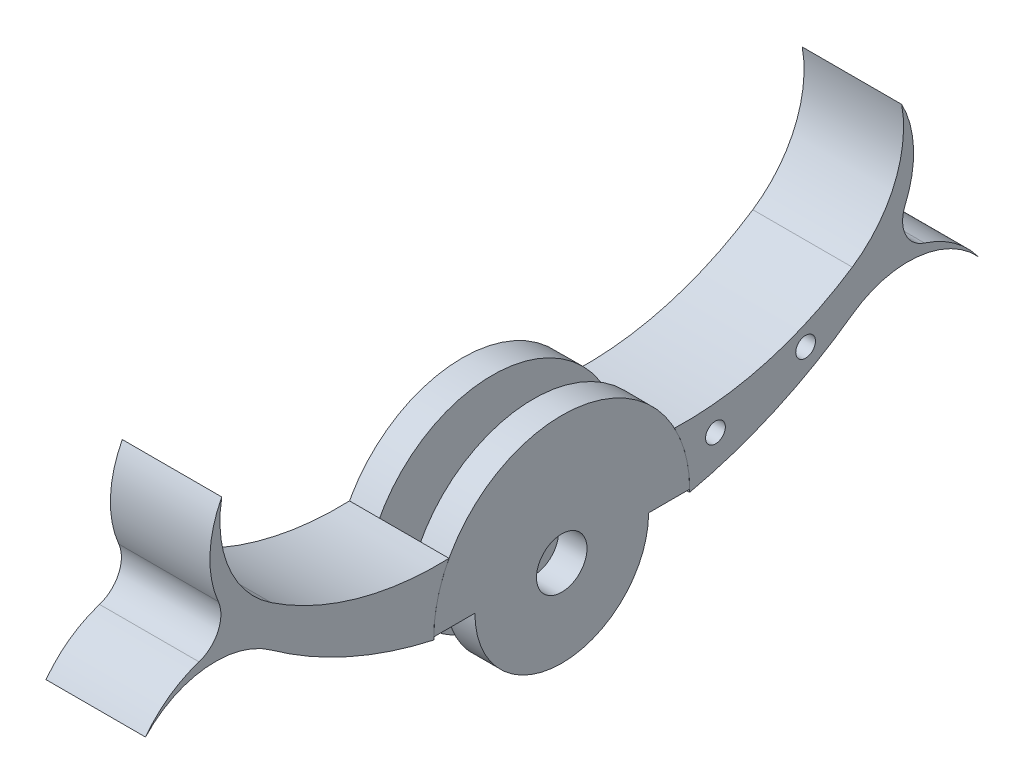
ISO-10303-21;
HEADER;
FILE_DESCRIPTION(('STEP AP214'),'2;1');
FILE_NAME('part.step','',(''),(''),'','','');
FILE_SCHEMA(('AUTOMOTIVE_DESIGN { 1 0 10303 214 1 1 1 1 }'));
ENDSEC;
DATA;
#1=APPLICATION_CONTEXT('core data for automotive mechanical design processes');
#2=APPLICATION_PROTOCOL_DEFINITION('international standard','automotive_design',2000,#1);
#3=PRODUCT_CONTEXT('',#1,'mechanical');
#4=PRODUCT('Part','Part','',(#3));
#5=PRODUCT_RELATED_PRODUCT_CATEGORY('part','',(#4));
#6=PRODUCT_DEFINITION_FORMATION('','',#4);
#7=PRODUCT_DEFINITION_CONTEXT('part definition',#1,'design');
#8=PRODUCT_DEFINITION('design','',#6,#7);
#9=PRODUCT_DEFINITION_SHAPE('','',#8);
#10=(LENGTH_UNIT() NAMED_UNIT(*) SI_UNIT(.MILLI.,.METRE.));
#11=(NAMED_UNIT(*) PLANE_ANGLE_UNIT() SI_UNIT($,.RADIAN.));
#12=(NAMED_UNIT(*) SI_UNIT($,.STERADIAN.) SOLID_ANGLE_UNIT());
#13=UNCERTAINTY_MEASURE_WITH_UNIT(LENGTH_MEASURE(1.E-05),#10,'distance_accuracy_value','');
#14=(GEOMETRIC_REPRESENTATION_CONTEXT(3) GLOBAL_UNCERTAINTY_ASSIGNED_CONTEXT((#13)) GLOBAL_UNIT_ASSIGNED_CONTEXT((#10,
#11,#12)) REPRESENTATION_CONTEXT('',''));
#15=CARTESIAN_POINT('',(0.,0.,0.));
#16=DIRECTION('',(0.,0.,1.));
#17=DIRECTION('',(1.,0.,0.));
#18=AXIS2_PLACEMENT_3D('',#15,#16,#17);
#19=CARTESIAN_POINT('',(8.001,0.,0.));
#20=DIRECTION('',(1.,0.,0.));
#21=DIRECTION('',(0.,0.,1.));
#22=AXIS2_PLACEMENT_3D('',#19,#20,#21);
#23=PLANE('',#22);
#24=CARTESIAN_POINT('',(8.001,2.90956880333822,-12.3622170090417));
#25=DIRECTION('',(1.,0.,0.));
#26=DIRECTION('',(0.,0.,-1.));
#27=AXIS2_PLACEMENT_3D('',#24,#25,#26);
#28=CIRCLE('',#27,0.793749999999986);
#29=CARTESIAN_POINT('',(8.001,2.90956880333822,-13.1559670090417));
#30=VERTEX_POINT('',#29);
#31=EDGE_CURVE('E183',#30,#30,#28,.T.);
#32=ORIENTED_EDGE('',*,*,#31,.F.);
#33=EDGE_LOOP('',(#32));
#34=FACE_BOUND('',#33,.T.);
#35=CARTESIAN_POINT('',(8.001,5.2578195476266,-19.6113630581946));
#36=DIRECTION('',(1.,0.,0.));
#37=DIRECTION('',(0.,0.,-1.));
#38=AXIS2_PLACEMENT_3D('',#35,#36,#37);
#39=CIRCLE('',#38,0.793749999999986);
#40=CARTESIAN_POINT('',(8.001,5.2578195476266,-20.4051130581946));
#41=VERTEX_POINT('',#40);
#42=EDGE_CURVE('E132',#41,#41,#39,.T.);
#43=ORIENTED_EDGE('',*,*,#42,.F.);
#44=EDGE_LOOP('',(#43));
#45=FACE_BOUND('',#44,.T.);
#46=CARTESIAN_POINT('',(8.001,34.5934679798672,-2.58194272139042));
#47=DIRECTION('',(-1.,0.,0.));
#48=DIRECTION('',(0.,0.,1.));
#49=AXIS2_PLACEMENT_3D('',#46,#47,#48);
#50=CIRCLE('',#49,35.6553535156911);
#51=CARTESIAN_POINT('',(8.001,-0.219928201198768,-10.2846487828373));
#52=VERTEX_POINT('',#51);
#53=CARTESIAN_POINT('',(8.001,5.62207179880123,-23.3656487828373));
#54=VERTEX_POINT('',#53);
#55=EDGE_CURVE('E52',#52,#54,#50,.F.);
#56=ORIENTED_EDGE('',*,*,#55,.T.);
#57=CARTESIAN_POINT('',(8.001,-0.627053130674843,-27.848690430667));
#58=DIRECTION('',(-1.,0.,0.));
#59=DIRECTION('',(0.,0.,1.));
#60=AXIS2_PLACEMENT_3D('',#57,#58,#59);
#61=CIRCLE('',#60,7.69085332069039);
#62=CARTESIAN_POINT('',(8.001,4.61567464330049,-33.475681659411));
#63=VERTEX_POINT('',#62);
#64=EDGE_CURVE('E115',#54,#63,#61,.T.);
#65=ORIENTED_EDGE('',*,*,#64,.T.);
#66=CARTESIAN_POINT('',(8.001,-0.558812525632776,-26.5026890564416));
#67=DIRECTION('',(-1.,0.,0.));
#68=DIRECTION('',(0.,0.,1.));
#69=AXIS2_PLACEMENT_3D('',#66,#67,#68);
#70=CIRCLE('',#69,8.68319890953337);
#71=CARTESIAN_POINT('',(8.001,7.70415506120035,-29.1712673223852));
#72=VERTEX_POINT('',#71);
#73=EDGE_CURVE('E113',#63,#72,#70,.F.);
#74=ORIENTED_EDGE('',*,*,#73,.T.);
#75=CARTESIAN_POINT('',(8.001,10.1212294469447,-29.9518769647665));
#76=DIRECTION('',(-1.,0.,0.));
#77=DIRECTION('',(0.,0.,1.));
#78=AXIS2_PLACEMENT_3D('',#75,#76,#77);
#79=CIRCLE('',#78,2.54);
#80=CARTESIAN_POINT('',(8.001,11.1275475547437,-27.6197269125795));
#81=VERTEX_POINT('',#80);
#82=EDGE_CURVE('E153',#72,#81,#79,.T.);
#83=ORIENTED_EDGE('',*,*,#82,.T.);
#84=CARTESIAN_POINT('',(8.001,14.4101946702873,-20.0121666565386));
#85=DIRECTION('',(-1.,0.,0.));
#86=DIRECTION('',(0.,0.,1.));
#87=AXIS2_PLACEMENT_3D('',#84,#85,#86);
#88=CIRCLE('',#87,8.28557452048316);
#89=CARTESIAN_POINT('',(8.001,18.2736984419772,-27.3418381185222));
#90=VERTEX_POINT('',#89);
#91=EDGE_CURVE('E149',#81,#90,#88,.F.);
#92=ORIENTED_EDGE('',*,*,#91,.T.);
#93=CARTESIAN_POINT('',(8.001,16.6298694438391,-18.2266754483472));
#94=DIRECTION('',(-1.,0.,0.));
#95=DIRECTION('',(0.,0.,1.));
#96=AXIS2_PLACEMENT_3D('',#93,#94,#95);
#97=CIRCLE('',#96,9.26220083343437);
#98=CARTESIAN_POINT('',(8.001,8.92407179880123,-23.3656487828373));
#99=VERTEX_POINT('',#98);
#100=EDGE_CURVE('E145',#90,#99,#97,.T.);
#101=ORIENTED_EDGE('',*,*,#100,.T.);
#102=CARTESIAN_POINT('',(8.001,29.115893095207,-9.89978372942019));
#103=DIRECTION('',(-1.,0.,0.));
#104=DIRECTION('',(0.,0.,1.));
#105=AXIS2_PLACEMENT_3D('',#102,#103,#104);
#106=CIRCLE('',#105,24.27012914887);
#107=CARTESIAN_POINT('',(8.001,4.86007179880123,-9.06653578333517));
#108=VERTEX_POINT('',#107);
#109=EDGE_CURVE('E141',#99,#108,#106,.T.);
#110=ORIENTED_EDGE('',*,*,#109,.T.);
#111=CARTESIAN_POINT('',(8.001,-9.88358700437786E-13,4.13384604325273E-12));
#112=DIRECTION('',(-1.,0.,0.));
#113=DIRECTION('',(0.,0.,1.));
#114=AXIS2_PLACEMENT_3D('',#111,#112,#113);
#115=CIRCLE('',#114,10.2870000000041);
#116=EDGE_CURVE('E138',#108,#52,#115,.T.);
#117=ORIENTED_EDGE('',*,*,#116,.T.);
#118=EDGE_LOOP('',(#56,#65,#74,#83,#92,#101,#110,#117));
#119=FACE_BOUND('',#118,.T.);
#120=ADVANCED_FACE('F44',(#34,#45,#119),#23,.T.);
#121=CARTESIAN_POINT('',(0.,16.9832074245962,-15.2153165760287));
#122=DIRECTION('',(-1.,0.,0.));
#123=DIRECTION('',(0.,0.,-1.));
#124=AXIS2_PLACEMENT_3D('',#121,#122,#123);
#125=PLANE('',#124);
#126=CARTESIAN_POINT('',(0.,2.90956880333822,-12.3622170090417));
#127=DIRECTION('',(-1.,0.,0.));
#128=DIRECTION('',(0.,0.,1.));
#129=AXIS2_PLACEMENT_3D('',#126,#127,#128);
#130=CIRCLE('',#129,0.793749999999991);
#131=CARTESIAN_POINT('',(0.,2.90956880333822,-11.5684670090418));
#132=VERTEX_POINT('',#131);
#133=EDGE_CURVE('E186',#132,#132,#130,.T.);
#134=ORIENTED_EDGE('',*,*,#133,.F.);
#135=EDGE_LOOP('',(#134));
#136=FACE_BOUND('',#135,.T.);
#137=CARTESIAN_POINT('',(0.,5.2578195476266,-19.6113630581946));
#138=DIRECTION('',(-1.,0.,0.));
#139=DIRECTION('',(0.,0.,1.));
#140=AXIS2_PLACEMENT_3D('',#137,#138,#139);
#141=CIRCLE('',#140,0.793749999999991);
#142=CARTESIAN_POINT('',(0.,5.2578195476266,-18.8176130581947));
#143=VERTEX_POINT('',#142);
#144=EDGE_CURVE('E180',#143,#143,#141,.T.);
#145=ORIENTED_EDGE('',*,*,#144,.F.);
#146=EDGE_LOOP('',(#145));
#147=FACE_BOUND('',#146,.T.);
#148=CARTESIAN_POINT('',(0.,34.5934679798672,-2.58194272139042));
#149=DIRECTION('',(1.,0.,0.));
#150=DIRECTION('',(0.,0.,-1.));
#151=AXIS2_PLACEMENT_3D('',#148,#149,#150);
#152=CIRCLE('',#151,35.6553535156911);
#153=CARTESIAN_POINT('',(0.,-0.219928201198768,-10.2846487828373));
#154=VERTEX_POINT('',#153);
#155=CARTESIAN_POINT('',(0.,5.62207179880123,-23.3656487828373));
#156=VERTEX_POINT('',#155);
#157=EDGE_CURVE('E121',#154,#156,#152,.T.);
#158=ORIENTED_EDGE('',*,*,#157,.F.);
#159=CARTESIAN_POINT('',(0.,-9.88358700437786E-13,4.13384604325273E-12));
#160=DIRECTION('',(-1.,0.,0.));
#161=DIRECTION('',(0.,0.,1.));
#162=AXIS2_PLACEMENT_3D('',#159,#160,#161);
#163=CIRCLE('',#162,10.2870000000041);
#164=CARTESIAN_POINT('',(0.,4.86007179880123,-9.06653578333517));
#165=VERTEX_POINT('',#164);
#166=EDGE_CURVE('E134',#165,#154,#163,.T.);
#167=ORIENTED_EDGE('',*,*,#166,.F.);
#168=CARTESIAN_POINT('',(0.,29.115893095207,-9.89978372942019));
#169=DIRECTION('',(-1.,0.,0.));
#170=DIRECTION('',(0.,0.,-1.));
#171=AXIS2_PLACEMENT_3D('',#168,#169,#170);
#172=CIRCLE('',#171,24.27012914887);
#173=CARTESIAN_POINT('',(0.,8.92407179880123,-23.3656487828373));
#174=VERTEX_POINT('',#173);
#175=EDGE_CURVE('E172',#174,#165,#172,.T.);
#176=ORIENTED_EDGE('',*,*,#175,.F.);
#177=CARTESIAN_POINT('',(0.,16.6298694438391,-18.2266754483472));
#178=DIRECTION('',(-1.,0.,0.));
#179=DIRECTION('',(0.,0.,-1.));
#180=AXIS2_PLACEMENT_3D('',#177,#178,#179);
#181=CIRCLE('',#180,9.26220083343437);
#182=CARTESIAN_POINT('',(0.,18.2736984419772,-27.3418381185222));
#183=VERTEX_POINT('',#182);
#184=EDGE_CURVE('E171',#183,#174,#181,.T.);
#185=ORIENTED_EDGE('',*,*,#184,.F.);
#186=CARTESIAN_POINT('',(0.,14.4101946702873,-20.0121666565386));
#187=DIRECTION('',(1.,0.,0.));
#188=DIRECTION('',(0.,0.,1.));
#189=AXIS2_PLACEMENT_3D('',#186,#187,#188);
#190=CIRCLE('',#189,8.28557452048316);
#191=CARTESIAN_POINT('',(0.,11.1275475547437,-27.6197269125795));
#192=VERTEX_POINT('',#191);
#193=EDGE_CURVE('E127',#192,#183,#190,.T.);
#194=ORIENTED_EDGE('',*,*,#193,.F.);
#195=CARTESIAN_POINT('',(0.,10.1212294469447,-29.9518769647665));
#196=DIRECTION('',(-1.,0.,0.));
#197=DIRECTION('',(0.,0.,-1.));
#198=AXIS2_PLACEMENT_3D('',#195,#196,#197);
#199=CIRCLE('',#198,2.54);
#200=CARTESIAN_POINT('',(0.,7.70415506120035,-29.1712673223852));
#201=VERTEX_POINT('',#200);
#202=EDGE_CURVE('E125',#201,#192,#199,.T.);
#203=ORIENTED_EDGE('',*,*,#202,.F.);
#204=CARTESIAN_POINT('',(0.,-0.558812525632776,-26.5026890564416));
#205=DIRECTION('',(1.,0.,0.));
#206=DIRECTION('',(0.,0.,-1.));
#207=AXIS2_PLACEMENT_3D('',#204,#205,#206);
#208=CIRCLE('',#207,8.68319890953337);
#209=CARTESIAN_POINT('',(0.,4.61567464330049,-33.475681659411));
#210=VERTEX_POINT('',#209);
#211=EDGE_CURVE('E110',#210,#201,#208,.T.);
#212=ORIENTED_EDGE('',*,*,#211,.F.);
#213=CARTESIAN_POINT('',(0.,-0.627053130674843,-27.848690430667));
#214=DIRECTION('',(-1.,0.,0.));
#215=DIRECTION('',(0.,0.,1.));
#216=AXIS2_PLACEMENT_3D('',#213,#214,#215);
#217=CIRCLE('',#216,7.69085332069039);
#218=EDGE_CURVE('E116',#156,#210,#217,.T.);
#219=ORIENTED_EDGE('',*,*,#218,.F.);
#220=EDGE_LOOP('',(#158,#167,#176,#185,#194,#203,#212,#219));
#221=FACE_BOUND('',#220,.T.);
#222=ADVANCED_FACE('F123',(#136,#147,#221),#125,.T.);
#223=CARTESIAN_POINT('',(38.6248571838483,-0.627053130674843,-27.848690430667));
#224=DIRECTION('',(-1.,0.,0.));
#225=DIRECTION('',(0.,0.,-1.));
#226=AXIS2_PLACEMENT_3D('',#223,#224,#225);
#227=CYLINDRICAL_SURFACE('',#226,7.69085332069039);
#228=DIRECTION('',(-1.,0.,0.));
#229=VECTOR('',#228,1.);
#230=CARTESIAN_POINT('',(38.6248571838483,5.62207179880123,-23.3656487828373));
#231=LINE('',#230,#229);
#232=EDGE_CURVE('E12',#54,#156,#231,.T.);
#233=ORIENTED_EDGE('',*,*,#232,.T.);
#234=ORIENTED_EDGE('',*,*,#218,.T.);
#235=DIRECTION('',(-1.,0.,0.));
#236=VECTOR('',#235,1.);
#237=CARTESIAN_POINT('',(38.6248571838483,4.61567464330049,-33.475681659411));
#238=LINE('',#237,#236);
#239=EDGE_CURVE('E93',#63,#210,#238,.T.);
#240=ORIENTED_EDGE('',*,*,#239,.F.);
#241=ORIENTED_EDGE('',*,*,#64,.F.);
#242=EDGE_LOOP('',(#233,#234,#240,#241));
#243=FACE_BOUND('',#242,.T.);
#244=ADVANCED_FACE('F117',(#243),#227,.F.);
#245=CARTESIAN_POINT('',(38.6248571838483,-0.558812525632776,-26.5026890564416));
#246=DIRECTION('',(-1.,0.,0.));
#247=DIRECTION('',(0.,0.,-1.));
#248=AXIS2_PLACEMENT_3D('',#245,#246,#247);
#249=CYLINDRICAL_SURFACE('',#248,8.68319890953337);
#250=ORIENTED_EDGE('',*,*,#239,.T.);
#251=ORIENTED_EDGE('',*,*,#211,.T.);
#252=DIRECTION('',(-1.,0.,0.));
#253=VECTOR('',#252,1.);
#254=CARTESIAN_POINT('',(38.6248571838483,7.70415506120035,-29.1712673223852));
#255=LINE('',#254,#253);
#256=EDGE_CURVE('E88',#72,#201,#255,.T.);
#257=ORIENTED_EDGE('',*,*,#256,.F.);
#258=ORIENTED_EDGE('',*,*,#73,.F.);
#259=EDGE_LOOP('',(#250,#251,#257,#258));
#260=FACE_BOUND('',#259,.T.);
#261=ADVANCED_FACE('F108',(#260),#249,.T.);
#262=CARTESIAN_POINT('',(38.6248571838483,10.1212294469447,-29.9518769647665));
#263=DIRECTION('',(-1.,0.,0.));
#264=DIRECTION('',(0.,0.,-1.));
#265=AXIS2_PLACEMENT_3D('',#262,#263,#264);
#266=CYLINDRICAL_SURFACE('',#265,2.54);
#267=ORIENTED_EDGE('',*,*,#256,.T.);
#268=ORIENTED_EDGE('',*,*,#202,.T.);
#269=DIRECTION('',(-1.,0.,0.));
#270=VECTOR('',#269,1.);
#271=CARTESIAN_POINT('',(38.6248571838483,11.1275475547437,-27.6197269125795));
#272=LINE('',#271,#270);
#273=EDGE_CURVE('E152',#81,#192,#272,.T.);
#274=ORIENTED_EDGE('',*,*,#273,.F.);
#275=ORIENTED_EDGE('',*,*,#82,.F.);
#276=EDGE_LOOP('',(#267,#268,#274,#275));
#277=FACE_BOUND('',#276,.T.);
#278=ADVANCED_FACE('F168',(#277),#266,.F.);
#279=CARTESIAN_POINT('',(38.6248571838483,14.4101946702873,-20.0121666565386));
#280=DIRECTION('',(-1.,0.,0.));
#281=DIRECTION('',(0.,0.,-1.));
#282=AXIS2_PLACEMENT_3D('',#279,#280,#281);
#283=CYLINDRICAL_SURFACE('',#282,8.28557452048316);
#284=ORIENTED_EDGE('',*,*,#273,.T.);
#285=ORIENTED_EDGE('',*,*,#193,.T.);
#286=DIRECTION('',(-1.,0.,0.));
#287=VECTOR('',#286,1.);
#288=CARTESIAN_POINT('',(38.6248571838483,18.2736984419772,-27.3418381185222));
#289=LINE('',#288,#287);
#290=EDGE_CURVE('E148',#90,#183,#289,.T.);
#291=ORIENTED_EDGE('',*,*,#290,.F.);
#292=ORIENTED_EDGE('',*,*,#91,.F.);
#293=EDGE_LOOP('',(#284,#285,#291,#292));
#294=FACE_BOUND('',#293,.T.);
#295=ADVANCED_FACE('F166',(#294),#283,.T.);
#296=CARTESIAN_POINT('',(38.6248571838483,16.6298694438391,-18.2266754483472));
#297=DIRECTION('',(-1.,0.,0.));
#298=DIRECTION('',(0.,0.,-1.));
#299=AXIS2_PLACEMENT_3D('',#296,#297,#298);
#300=CYLINDRICAL_SURFACE('',#299,9.26220083343437);
#301=ORIENTED_EDGE('',*,*,#290,.T.);
#302=ORIENTED_EDGE('',*,*,#184,.T.);
#303=DIRECTION('',(-1.,0.,0.));
#304=VECTOR('',#303,1.);
#305=CARTESIAN_POINT('',(38.6248571838483,8.92407179880123,-23.3656487828373));
#306=LINE('',#305,#304);
#307=EDGE_CURVE('E144',#99,#174,#306,.T.);
#308=ORIENTED_EDGE('',*,*,#307,.F.);
#309=ORIENTED_EDGE('',*,*,#100,.F.);
#310=EDGE_LOOP('',(#301,#302,#308,#309));
#311=FACE_BOUND('',#310,.T.);
#312=ADVANCED_FACE('F230',(#311),#300,.F.);
#313=CARTESIAN_POINT('',(38.6248571838483,29.115893095207,-9.89978372942019));
#314=DIRECTION('',(-1.,0.,0.));
#315=DIRECTION('',(0.,0.,-1.));
#316=AXIS2_PLACEMENT_3D('',#313,#314,#315);
#317=CYLINDRICAL_SURFACE('',#316,24.27012914887);
#318=ORIENTED_EDGE('',*,*,#307,.T.);
#319=ORIENTED_EDGE('',*,*,#175,.T.);
#320=DIRECTION('',(-1.,0.,0.));
#321=VECTOR('',#320,1.);
#322=CARTESIAN_POINT('',(38.6248571838483,4.86007179880123,-9.06653578333517));
#323=LINE('',#322,#321);
#324=EDGE_CURVE('E140',#108,#165,#323,.T.);
#325=ORIENTED_EDGE('',*,*,#324,.F.);
#326=ORIENTED_EDGE('',*,*,#109,.F.);
#327=EDGE_LOOP('',(#318,#319,#325,#326));
#328=FACE_BOUND('',#327,.T.);
#329=ADVANCED_FACE('F227',(#328),#317,.F.);
#330=CARTESIAN_POINT('',(38.6248571838483,-9.88358700437786E-13,4.13384604325273E-12));
#331=DIRECTION('',(-1.,0.,0.));
#332=DIRECTION('',(0.,0.,-1.));
#333=AXIS2_PLACEMENT_3D('',#330,#331,#332);
#334=CYLINDRICAL_SURFACE('',#333,10.2870000000041);
#335=ORIENTED_EDGE('',*,*,#166,.T.);
#336=DIRECTION('',(-1.,0.,0.));
#337=VECTOR('',#336,1.);
#338=CARTESIAN_POINT('',(38.6248571838483,-0.219928201198768,-10.2846487828373));
#339=LINE('',#338,#337);
#340=EDGE_CURVE('E137',#52,#154,#339,.T.);
#341=ORIENTED_EDGE('',*,*,#340,.F.);
#342=ORIENTED_EDGE('',*,*,#116,.F.);
#343=ORIENTED_EDGE('',*,*,#324,.T.);
#344=EDGE_LOOP('',(#335,#341,#342,#343));
#345=FACE_BOUND('',#344,.T.);
#346=ADVANCED_FACE('F208',(#345),#334,.F.);
#347=CARTESIAN_POINT('',(38.6248571838483,34.5934679798672,-2.58194272139042));
#348=DIRECTION('',(-1.,0.,0.));
#349=DIRECTION('',(0.,0.,-1.));
#350=AXIS2_PLACEMENT_3D('',#347,#348,#349);
#351=CYLINDRICAL_SURFACE('',#350,35.6553535156911);
#352=ORIENTED_EDGE('',*,*,#340,.T.);
#353=ORIENTED_EDGE('',*,*,#157,.T.);
#354=ORIENTED_EDGE('',*,*,#232,.F.);
#355=ORIENTED_EDGE('',*,*,#55,.F.);
#356=EDGE_LOOP('',(#352,#353,#354,#355));
#357=FACE_BOUND('',#356,.T.);
#358=ADVANCED_FACE('F199',(#357),#351,.T.);
#359=CARTESIAN_POINT('',(0.,5.2578195476266,-19.6113630581946));
#360=DIRECTION('',(-1.,0.,0.));
#361=DIRECTION('',(0.,0.,1.));
#362=AXIS2_PLACEMENT_3D('',#359,#360,#361);
#363=CYLINDRICAL_SURFACE('',#362,0.793749999999986);
#364=ORIENTED_EDGE('',*,*,#42,.T.);
#365=EDGE_LOOP('',(#364));
#366=FACE_BOUND('',#365,.T.);
#367=ORIENTED_EDGE('',*,*,#144,.T.);
#368=EDGE_LOOP('',(#367));
#369=FACE_BOUND('',#368,.T.);
#370=ADVANCED_FACE('F197',(#366,#369),#363,.F.);
#371=CARTESIAN_POINT('',(0.,2.90956880333822,-12.3622170090417));
#372=DIRECTION('',(-1.,0.,0.));
#373=DIRECTION('',(0.,0.,1.));
#374=AXIS2_PLACEMENT_3D('',#371,#372,#373);
#375=CYLINDRICAL_SURFACE('',#374,0.793749999999986);
#376=ORIENTED_EDGE('',*,*,#31,.T.);
#377=EDGE_LOOP('',(#376));
#378=FACE_BOUND('',#377,.T.);
#379=ORIENTED_EDGE('',*,*,#133,.T.);
#380=EDGE_LOOP('',(#379));
#381=FACE_BOUND('',#380,.T.);
#382=ADVANCED_FACE('F190',(#378,#381),#375,.F.);
#383=CLOSED_SHELL('',(#120,#222,#244,#261,#278,#295,#312,#329,#346,#358,#370,#382));
#384=MANIFOLD_SOLID_BREP('B2',#383);
#385=CARTESIAN_POINT('',(8.001,0.,0.));
#386=DIRECTION('',(1.,0.,0.));
#387=DIRECTION('',(0.,0.,-1.));
#388=AXIS2_PLACEMENT_3D('',#385,#386,#387);
#389=PLANE('',#388);
#390=CARTESIAN_POINT('',(8.001,34.5934679798672,2.58194272139042));
#391=DIRECTION('',(1.,0.,0.));
#392=DIRECTION('',(0.,0.,-1.));
#393=AXIS2_PLACEMENT_3D('',#390,#391,#392);
#394=CIRCLE('',#393,35.6553535156911);
#395=CARTESIAN_POINT('',(8.001,-0.219928201198768,10.2846487828373));
#396=VERTEX_POINT('',#395);
#397=CARTESIAN_POINT('',(8.001,5.62207179880123,23.3656487828373));
#398=VERTEX_POINT('',#397);
#399=EDGE_CURVE('E330',#396,#398,#394,.F.);
#400=ORIENTED_EDGE('',*,*,#399,.F.);
#401=CARTESIAN_POINT('',(8.001,-9.88358700437786E-13,-4.13384604325273E-12));
#402=DIRECTION('',(1.,0.,0.));
#403=DIRECTION('',(0.,0.,-1.));
#404=AXIS2_PLACEMENT_3D('',#401,#402,#403);
#405=CIRCLE('',#404,10.2870000000041);
#406=CARTESIAN_POINT('',(8.001,4.86007179880123,9.06653578333517));
#407=VERTEX_POINT('',#406);
#408=EDGE_CURVE('E415',#407,#396,#405,.T.);
#409=ORIENTED_EDGE('',*,*,#408,.F.);
#410=CARTESIAN_POINT('',(8.001,29.115893095207,9.89978372942019));
#411=DIRECTION('',(1.,0.,0.));
#412=DIRECTION('',(0.,0.,-1.));
#413=AXIS2_PLACEMENT_3D('',#410,#411,#412);
#414=CIRCLE('',#413,24.27012914887);
#415=CARTESIAN_POINT('',(8.001,8.92407179880123,23.3656487828373));
#416=VERTEX_POINT('',#415);
#417=EDGE_CURVE('E418',#416,#407,#414,.T.);
#418=ORIENTED_EDGE('',*,*,#417,.F.);
#419=CARTESIAN_POINT('',(8.001,16.6298694438391,18.2266754483472));
#420=DIRECTION('',(1.,0.,0.));
#421=DIRECTION('',(0.,0.,-1.));
#422=AXIS2_PLACEMENT_3D('',#419,#420,#421);
#423=CIRCLE('',#422,9.26220083343437);
#424=CARTESIAN_POINT('',(8.001,18.2736984419772,27.3418381185222));
#425=VERTEX_POINT('',#424);
#426=EDGE_CURVE('E422',#425,#416,#423,.T.);
#427=ORIENTED_EDGE('',*,*,#426,.F.);
#428=CARTESIAN_POINT('',(8.001,14.4101946702873,20.0121666565386));
#429=DIRECTION('',(1.,0.,0.));
#430=DIRECTION('',(0.,0.,-1.));
#431=AXIS2_PLACEMENT_3D('',#428,#429,#430);
#432=CIRCLE('',#431,8.28557452048316);
#433=CARTESIAN_POINT('',(8.001,11.1275475547437,27.6197269125795));
#434=VERTEX_POINT('',#433);
#435=EDGE_CURVE('E426',#434,#425,#432,.F.);
#436=ORIENTED_EDGE('',*,*,#435,.F.);
#437=CARTESIAN_POINT('',(8.001,10.1212294469447,29.9518769647665));
#438=DIRECTION('',(1.,0.,0.));
#439=DIRECTION('',(0.,0.,-1.));
#440=AXIS2_PLACEMENT_3D('',#437,#438,#439);
#441=CIRCLE('',#440,2.54);
#442=CARTESIAN_POINT('',(8.001,7.70415506120035,29.1712673223852));
#443=VERTEX_POINT('',#442);
#444=EDGE_CURVE('E365',#443,#434,#441,.T.);
#445=ORIENTED_EDGE('',*,*,#444,.F.);
#446=CARTESIAN_POINT('',(8.001,-0.558812525632776,26.5026890564416));
#447=DIRECTION('',(1.,0.,0.));
#448=DIRECTION('',(0.,0.,-1.));
#449=AXIS2_PLACEMENT_3D('',#446,#447,#448);
#450=CIRCLE('',#449,8.68319890953337);
#451=CARTESIAN_POINT('',(8.001,4.61567464330049,33.475681659411));
#452=VERTEX_POINT('',#451);
#453=EDGE_CURVE('E370',#452,#443,#450,.F.);
#454=ORIENTED_EDGE('',*,*,#453,.F.);
#455=CARTESIAN_POINT('',(8.001,-0.627053130674843,27.848690430667));
#456=DIRECTION('',(1.,0.,0.));
#457=DIRECTION('',(0.,0.,-1.));
#458=AXIS2_PLACEMENT_3D('',#455,#456,#457);
#459=CIRCLE('',#458,7.69085332069039);
#460=EDGE_CURVE('E397',#398,#452,#459,.T.);
#461=ORIENTED_EDGE('',*,*,#460,.F.);
#462=EDGE_LOOP('',(#400,#409,#418,#427,#436,#445,#454,#461));
#463=FACE_BOUND('',#462,.T.);
#464=ADVANCED_FACE('F322',(#463),#389,.T.);
#465=CARTESIAN_POINT('',(0.,16.9832074245962,15.2153165760287));
#466=DIRECTION('',(-1.,0.,0.));
#467=DIRECTION('',(0.,0.,1.));
#468=AXIS2_PLACEMENT_3D('',#465,#466,#467);
#469=PLANE('',#468);
#470=CARTESIAN_POINT('',(0.,34.5934679798672,2.58194272139042));
#471=DIRECTION('',(-1.,0.,0.));
#472=DIRECTION('',(0.,0.,1.));
#473=AXIS2_PLACEMENT_3D('',#470,#471,#472);
#474=CIRCLE('',#473,35.6553535156911);
#475=CARTESIAN_POINT('',(0.,-0.219928201198768,10.2846487828373));
#476=VERTEX_POINT('',#475);
#477=CARTESIAN_POINT('',(0.,5.62207179880123,23.3656487828373));
#478=VERTEX_POINT('',#477);
#479=EDGE_CURVE('E406',#476,#478,#474,.T.);
#480=ORIENTED_EDGE('',*,*,#479,.T.);
#481=CARTESIAN_POINT('',(0.,-0.627053130674843,27.848690430667));
#482=DIRECTION('',(1.,0.,0.));
#483=DIRECTION('',(0.,0.,-1.));
#484=AXIS2_PLACEMENT_3D('',#481,#482,#483);
#485=CIRCLE('',#484,7.69085332069039);
#486=CARTESIAN_POINT('',(0.,4.61567464330049,33.475681659411));
#487=VERTEX_POINT('',#486);
#488=EDGE_CURVE('E395',#478,#487,#485,.T.);
#489=ORIENTED_EDGE('',*,*,#488,.T.);
#490=CARTESIAN_POINT('',(0.,-0.558812525632776,26.5026890564416));
#491=DIRECTION('',(-1.,0.,0.));
#492=DIRECTION('',(0.,0.,1.));
#493=AXIS2_PLACEMENT_3D('',#490,#491,#492);
#494=CIRCLE('',#493,8.68319890953337);
#495=CARTESIAN_POINT('',(0.,7.70415506120035,29.1712673223852));
#496=VERTEX_POINT('',#495);
#497=EDGE_CURVE('E399',#487,#496,#494,.T.);
#498=ORIENTED_EDGE('',*,*,#497,.T.);
#499=CARTESIAN_POINT('',(0.,10.1212294469447,29.9518769647665));
#500=DIRECTION('',(1.,0.,0.));
#501=DIRECTION('',(0.,0.,1.));
#502=AXIS2_PLACEMENT_3D('',#499,#500,#501);
#503=CIRCLE('',#502,2.54);
#504=CARTESIAN_POINT('',(0.,11.1275475547437,27.6197269125795));
#505=VERTEX_POINT('',#504);
#506=EDGE_CURVE('E403',#496,#505,#503,.T.);
#507=ORIENTED_EDGE('',*,*,#506,.T.);
#508=CARTESIAN_POINT('',(0.,14.4101946702873,20.0121666565386));
#509=DIRECTION('',(-1.,0.,0.));
#510=DIRECTION('',(0.,0.,-1.));
#511=AXIS2_PLACEMENT_3D('',#508,#509,#510);
#512=CIRCLE('',#511,8.28557452048316);
#513=CARTESIAN_POINT('',(0.,18.2736984419772,27.3418381185222));
#514=VERTEX_POINT('',#513);
#515=EDGE_CURVE('E444',#505,#514,#512,.T.);
#516=ORIENTED_EDGE('',*,*,#515,.T.);
#517=CARTESIAN_POINT('',(0.,16.6298694438391,18.2266754483472));
#518=DIRECTION('',(1.,0.,0.));
#519=DIRECTION('',(0.,0.,1.));
#520=AXIS2_PLACEMENT_3D('',#517,#518,#519);
#521=CIRCLE('',#520,9.26220083343437);
#522=CARTESIAN_POINT('',(0.,8.92407179880123,23.3656487828373));
#523=VERTEX_POINT('',#522);
#524=EDGE_CURVE('E449',#514,#523,#521,.T.);
#525=ORIENTED_EDGE('',*,*,#524,.T.);
#526=CARTESIAN_POINT('',(0.,29.115893095207,9.89978372942019));
#527=DIRECTION('',(1.,0.,0.));
#528=DIRECTION('',(0.,0.,1.));
#529=AXIS2_PLACEMENT_3D('',#526,#527,#528);
#530=CIRCLE('',#529,24.27012914887);
#531=CARTESIAN_POINT('',(0.,4.86007179880123,9.06653578333517));
#532=VERTEX_POINT('',#531);
#533=EDGE_CURVE('E453',#523,#532,#530,.T.);
#534=ORIENTED_EDGE('',*,*,#533,.T.);
#535=CARTESIAN_POINT('',(0.,-9.88358700437786E-13,-4.13384604325273E-12));
#536=DIRECTION('',(1.,0.,0.));
#537=DIRECTION('',(0.,0.,-1.));
#538=AXIS2_PLACEMENT_3D('',#535,#536,#537);
#539=CIRCLE('',#538,10.2870000000041);
#540=EDGE_CURVE('E412',#532,#476,#539,.T.);
#541=ORIENTED_EDGE('',*,*,#540,.T.);
#542=EDGE_LOOP('',(#480,#489,#498,#507,#516,#525,#534,#541));
#543=FACE_BOUND('',#542,.T.);
#544=ADVANCED_FACE('F405',(#543),#469,.T.);
#545=CARTESIAN_POINT('',(38.6248571838483,-0.627053130674843,27.848690430667));
#546=DIRECTION('',(-1.,0.,0.));
#547=DIRECTION('',(0.,0.,1.));
#548=AXIS2_PLACEMENT_3D('',#545,#546,#547);
#549=CYLINDRICAL_SURFACE('',#548,7.69085332069039);
#550=DIRECTION('',(-1.,0.,0.));
#551=VECTOR('',#550,1.);
#552=CARTESIAN_POINT('',(38.6248571838483,5.62207179880123,23.3656487828373));
#553=LINE('',#552,#551);
#554=EDGE_CURVE('E42',#398,#478,#553,.T.);
#555=ORIENTED_EDGE('',*,*,#554,.F.);
#556=ORIENTED_EDGE('',*,*,#460,.T.);
#557=DIRECTION('',(-1.,0.,0.));
#558=VECTOR('',#557,1.);
#559=CARTESIAN_POINT('',(38.6248571838483,4.61567464330049,33.475681659411));
#560=LINE('',#559,#558);
#561=EDGE_CURVE('E392',#452,#487,#560,.T.);
#562=ORIENTED_EDGE('',*,*,#561,.T.);
#563=ORIENTED_EDGE('',*,*,#488,.F.);
#564=EDGE_LOOP('',(#555,#556,#562,#563));
#565=FACE_BOUND('',#564,.T.);
#566=ADVANCED_FACE('F393',(#565),#549,.F.);
#567=CARTESIAN_POINT('',(38.6248571838483,-0.558812525632776,26.5026890564416));
#568=DIRECTION('',(-1.,0.,0.));
#569=DIRECTION('',(0.,0.,1.));
#570=AXIS2_PLACEMENT_3D('',#567,#568,#569);
#571=CYLINDRICAL_SURFACE('',#570,8.68319890953337);
#572=ORIENTED_EDGE('',*,*,#561,.F.);
#573=ORIENTED_EDGE('',*,*,#453,.T.);
#574=DIRECTION('',(-1.,0.,0.));
#575=VECTOR('',#574,1.);
#576=CARTESIAN_POINT('',(38.6248571838483,7.70415506120035,29.1712673223852));
#577=LINE('',#576,#575);
#578=EDGE_CURVE('E387',#443,#496,#577,.T.);
#579=ORIENTED_EDGE('',*,*,#578,.T.);
#580=ORIENTED_EDGE('',*,*,#497,.F.);
#581=EDGE_LOOP('',(#572,#573,#579,#580));
#582=FACE_BOUND('',#581,.T.);
#583=ADVANCED_FACE('F400',(#582),#571,.T.);
#584=CARTESIAN_POINT('',(38.6248571838483,10.1212294469447,29.9518769647665));
#585=DIRECTION('',(-1.,0.,0.));
#586=DIRECTION('',(0.,0.,1.));
#587=AXIS2_PLACEMENT_3D('',#584,#585,#586);
#588=CYLINDRICAL_SURFACE('',#587,2.54);
#589=ORIENTED_EDGE('',*,*,#578,.F.);
#590=ORIENTED_EDGE('',*,*,#444,.T.);
#591=DIRECTION('',(-1.,0.,0.));
#592=VECTOR('',#591,1.);
#593=CARTESIAN_POINT('',(38.6248571838483,11.1275475547437,27.6197269125795));
#594=LINE('',#593,#592);
#595=EDGE_CURVE('E429',#434,#505,#594,.T.);
#596=ORIENTED_EDGE('',*,*,#595,.T.);
#597=ORIENTED_EDGE('',*,*,#506,.F.);
#598=EDGE_LOOP('',(#589,#590,#596,#597));
#599=FACE_BOUND('',#598,.T.);
#600=ADVANCED_FACE('F441',(#599),#588,.F.);
#601=CARTESIAN_POINT('',(38.6248571838483,14.4101946702873,20.0121666565386));
#602=DIRECTION('',(-1.,0.,0.));
#603=DIRECTION('',(0.,0.,1.));
#604=AXIS2_PLACEMENT_3D('',#601,#602,#603);
#605=CYLINDRICAL_SURFACE('',#604,8.28557452048316);
#606=ORIENTED_EDGE('',*,*,#595,.F.);
#607=ORIENTED_EDGE('',*,*,#435,.T.);
#608=DIRECTION('',(-1.,0.,0.));
#609=VECTOR('',#608,1.);
#610=CARTESIAN_POINT('',(38.6248571838483,18.2736984419772,27.3418381185222));
#611=LINE('',#610,#609);
#612=EDGE_CURVE('E425',#425,#514,#611,.T.);
#613=ORIENTED_EDGE('',*,*,#612,.T.);
#614=ORIENTED_EDGE('',*,*,#515,.F.);
#615=EDGE_LOOP('',(#606,#607,#613,#614));
#616=FACE_BOUND('',#615,.T.);
#617=ADVANCED_FACE('F445',(#616),#605,.T.);
#618=CARTESIAN_POINT('',(38.6248571838483,16.6298694438391,18.2266754483472));
#619=DIRECTION('',(-1.,0.,0.));
#620=DIRECTION('',(0.,0.,1.));
#621=AXIS2_PLACEMENT_3D('',#618,#619,#620);
#622=CYLINDRICAL_SURFACE('',#621,9.26220083343437);
#623=ORIENTED_EDGE('',*,*,#612,.F.);
#624=ORIENTED_EDGE('',*,*,#426,.T.);
#625=DIRECTION('',(-1.,0.,0.));
#626=VECTOR('',#625,1.);
#627=CARTESIAN_POINT('',(38.6248571838483,8.92407179880123,23.3656487828373));
#628=LINE('',#627,#626);
#629=EDGE_CURVE('E421',#416,#523,#628,.T.);
#630=ORIENTED_EDGE('',*,*,#629,.T.);
#631=ORIENTED_EDGE('',*,*,#524,.F.);
#632=EDGE_LOOP('',(#623,#624,#630,#631));
#633=FACE_BOUND('',#632,.T.);
#634=ADVANCED_FACE('F479',(#633),#622,.F.);
#635=CARTESIAN_POINT('',(38.6248571838483,29.115893095207,9.89978372942019));
#636=DIRECTION('',(-1.,0.,0.));
#637=DIRECTION('',(0.,0.,1.));
#638=AXIS2_PLACEMENT_3D('',#635,#636,#637);
#639=CYLINDRICAL_SURFACE('',#638,24.27012914887);
#640=ORIENTED_EDGE('',*,*,#629,.F.);
#641=ORIENTED_EDGE('',*,*,#417,.T.);
#642=DIRECTION('',(-1.,0.,0.));
#643=VECTOR('',#642,1.);
#644=CARTESIAN_POINT('',(38.6248571838483,4.86007179880123,9.06653578333517));
#645=LINE('',#644,#643);
#646=EDGE_CURVE('E417',#407,#532,#645,.T.);
#647=ORIENTED_EDGE('',*,*,#646,.T.);
#648=ORIENTED_EDGE('',*,*,#533,.F.);
#649=EDGE_LOOP('',(#640,#641,#647,#648));
#650=FACE_BOUND('',#649,.T.);
#651=ADVANCED_FACE('F469',(#650),#639,.F.);
#652=CARTESIAN_POINT('',(38.6248571838483,-9.88358700437786E-13,-4.13384604325273E-12));
#653=DIRECTION('',(-1.,0.,0.));
#654=DIRECTION('',(0.,0.,1.));
#655=AXIS2_PLACEMENT_3D('',#652,#653,#654);
#656=CYLINDRICAL_SURFACE('',#655,10.2870000000041);
#657=ORIENTED_EDGE('',*,*,#408,.T.);
#658=DIRECTION('',(-1.,0.,0.));
#659=VECTOR('',#658,1.);
#660=CARTESIAN_POINT('',(38.6248571838483,-0.219928201198768,10.2846487828373));
#661=LINE('',#660,#659);
#662=EDGE_CURVE('E414',#396,#476,#661,.T.);
#663=ORIENTED_EDGE('',*,*,#662,.T.);
#664=ORIENTED_EDGE('',*,*,#540,.F.);
#665=ORIENTED_EDGE('',*,*,#646,.F.);
#666=EDGE_LOOP('',(#657,#663,#664,#665));
#667=FACE_BOUND('',#666,.T.);
#668=ADVANCED_FACE('F461',(#667),#656,.F.);
#669=CARTESIAN_POINT('',(38.6248571838483,34.5934679798672,2.58194272139042));
#670=DIRECTION('',(-1.,0.,0.));
#671=DIRECTION('',(0.,0.,1.));
#672=AXIS2_PLACEMENT_3D('',#669,#670,#671);
#673=CYLINDRICAL_SURFACE('',#672,35.6553535156911);
#674=ORIENTED_EDGE('',*,*,#662,.F.);
#675=ORIENTED_EDGE('',*,*,#399,.T.);
#676=ORIENTED_EDGE('',*,*,#554,.T.);
#677=ORIENTED_EDGE('',*,*,#479,.F.);
#678=EDGE_LOOP('',(#674,#675,#676,#677));
#679=FACE_BOUND('',#678,.T.);
#680=ADVANCED_FACE('F463',(#679),#673,.T.);
#681=CLOSED_SHELL('',(#464,#544,#566,#583,#600,#617,#634,#651,#668,#680));
#682=MANIFOLD_SOLID_BREP('B6',#681);
#683=CARTESIAN_POINT('',(-23.0024312845404,0.,0.));
#684=DIRECTION('',(1.,0.,0.));
#685=DIRECTION('',(0.,0.,-1.));
#686=AXIS2_PLACEMENT_3D('',#683,#684,#685);
#687=CYLINDRICAL_SURFACE('',#686,6.985);
#688=CARTESIAN_POINT('',(5.715,0.,0.));
#689=DIRECTION('',(1.,0.,0.));
#690=DIRECTION('',(0.,0.,-1.));
#691=AXIS2_PLACEMENT_3D('',#688,#689,#690);
#692=CIRCLE('',#691,6.985);
#693=CARTESIAN_POINT('',(5.715,0.,6.985));
#694=VERTEX_POINT('',#693);
#695=CARTESIAN_POINT('',(5.715,0.,-6.985));
#696=VERTEX_POINT('',#695);
#697=EDGE_CURVE('E701',#694,#696,#692,.T.);
#698=ORIENTED_EDGE('',*,*,#697,.T.);
#699=DIRECTION('',(1.,0.,0.));
#700=VECTOR('',#699,1.);
#701=CARTESIAN_POINT('',(-23.0024312845404,0.,-6.985));
#702=LINE('',#701,#700);
#703=CARTESIAN_POINT('',(8.001,0.,-6.985));
#704=VERTEX_POINT('',#703);
#705=EDGE_CURVE('E666',#696,#704,#702,.T.);
#706=ORIENTED_EDGE('',*,*,#705,.T.);
#707=CARTESIAN_POINT('',(8.001,0.,0.));
#708=DIRECTION('',(-1.,0.,0.));
#709=DIRECTION('',(0.,0.,1.));
#710=AXIS2_PLACEMENT_3D('',#707,#708,#709);
#711=CIRCLE('',#710,6.985);
#712=CARTESIAN_POINT('',(8.001,0.,6.985));
#713=VERTEX_POINT('',#712);
#714=EDGE_CURVE('E676',#704,#713,#711,.T.);
#715=ORIENTED_EDGE('',*,*,#714,.T.);
#716=DIRECTION('',(1.,0.,0.));
#717=VECTOR('',#716,1.);
#718=CARTESIAN_POINT('',(-23.0024312845404,0.,6.985));
#719=LINE('',#718,#717);
#720=EDGE_CURVE('E661',#694,#713,#719,.T.);
#721=ORIENTED_EDGE('',*,*,#720,.F.);
#722=EDGE_LOOP('',(#698,#706,#715,#721));
#723=FACE_BOUND('',#722,.T.);
#724=ADVANCED_FACE('F549',(#723),#687,.T.);
#725=CARTESIAN_POINT('',(8.001,0.,0.));
#726=DIRECTION('',(-1.,0.,0.));
#727=DIRECTION('',(0.,0.,1.));
#728=AXIS2_PLACEMENT_3D('',#725,#726,#727);
#729=CYLINDRICAL_SURFACE('',#728,10.287);
#730=DIRECTION('',(-1.,0.,0.));
#731=VECTOR('',#730,1.);
#732=CARTESIAN_POINT('',(8.00099999999999,2.58544053499593,-9.9568));
#733=LINE('',#732,#731);
#734=CARTESIAN_POINT('',(2.413,2.58544053499593,-9.9568));
#735=VERTEX_POINT('',#734);
#736=CARTESIAN_POINT('',(5.715,2.58544053499594,-9.9568));
#737=VERTEX_POINT('',#736);
#738=EDGE_CURVE('E679',#735,#737,#733,.F.);
#739=ORIENTED_EDGE('',*,*,#738,.T.);
#740=CARTESIAN_POINT('',(5.715,0.,0.));
#741=DIRECTION('',(1.,0.,0.));
#742=DIRECTION('',(0.,0.,-1.));
#743=AXIS2_PLACEMENT_3D('',#740,#741,#742);
#744=CIRCLE('',#743,10.287);
#745=CARTESIAN_POINT('',(5.715,2.58544053499596,9.9568));
#746=VERTEX_POINT('',#745);
#747=EDGE_CURVE('E693',#737,#746,#744,.T.);
#748=ORIENTED_EDGE('',*,*,#747,.T.);
#749=DIRECTION('',(-1.,0.,0.));
#750=VECTOR('',#749,1.);
#751=CARTESIAN_POINT('',(8.001,2.58544053499596,9.9568));
#752=LINE('',#751,#750);
#753=CARTESIAN_POINT('',(2.413,2.58544053499596,9.9568));
#754=VERTEX_POINT('',#753);
#755=EDGE_CURVE('E703',#746,#754,#752,.T.);
#756=ORIENTED_EDGE('',*,*,#755,.T.);
#757=CARTESIAN_POINT('',(2.413,0.,0.));
#758=DIRECTION('',(-1.,0.,0.));
#759=DIRECTION('',(0.,0.,1.));
#760=AXIS2_PLACEMENT_3D('',#757,#758,#759);
#761=CIRCLE('',#760,10.287);
#762=EDGE_CURVE('E637',#754,#735,#761,.T.);
#763=ORIENTED_EDGE('',*,*,#762,.T.);
#764=EDGE_LOOP('',(#739,#748,#756,#763));
#765=FACE_BOUND('',#764,.T.);
#766=CARTESIAN_POINT('',(8.001,0.,0.));
#767=DIRECTION('',(1.,0.,0.));
#768=DIRECTION('',(0.,0.,-1.));
#769=AXIS2_PLACEMENT_3D('',#766,#767,#768);
#770=CIRCLE('',#769,10.287);
#771=CARTESIAN_POINT('',(8.001,0.,-10.287));
#772=VERTEX_POINT('',#771);
#773=CARTESIAN_POINT('',(8.001,0.,10.287));
#774=VERTEX_POINT('',#773);
#775=EDGE_CURVE('E630',#772,#774,#770,.T.);
#776=ORIENTED_EDGE('',*,*,#775,.F.);
#777=DIRECTION('',(1.,0.,0.));
#778=VECTOR('',#777,1.);
#779=CARTESIAN_POINT('',(-23.0024312845404,0.,-10.287));
#780=LINE('',#779,#778);
#781=CARTESIAN_POINT('',(0.,0.,-10.287));
#782=VERTEX_POINT('',#781);
#783=EDGE_CURVE('E664',#782,#772,#780,.T.);
#784=ORIENTED_EDGE('',*,*,#783,.F.);
#785=CARTESIAN_POINT('',(0.,0.,0.));
#786=DIRECTION('',(1.,0.,0.));
#787=DIRECTION('',(0.,0.,-1.));
#788=AXIS2_PLACEMENT_3D('',#785,#786,#787);
#789=CIRCLE('',#788,10.287);
#790=CARTESIAN_POINT('',(0.,0.,10.287));
#791=VERTEX_POINT('',#790);
#792=EDGE_CURVE('E645',#782,#791,#789,.T.);
#793=ORIENTED_EDGE('',*,*,#792,.T.);
#794=DIRECTION('',(1.,0.,0.));
#795=VECTOR('',#794,1.);
#796=CARTESIAN_POINT('',(-23.0024312845404,0.,10.287));
#797=LINE('',#796,#795);
#798=EDGE_CURVE('E660',#791,#774,#797,.T.);
#799=ORIENTED_EDGE('',*,*,#798,.T.);
#800=EDGE_LOOP('',(#776,#784,#793,#799));
#801=FACE_BOUND('',#800,.T.);
#802=ADVANCED_FACE('F551',(#765,#801),#729,.T.);
#803=CARTESIAN_POINT('',(8.001,0.,0.));
#804=DIRECTION('',(1.,0.,0.));
#805=DIRECTION('',(0.,0.,-1.));
#806=AXIS2_PLACEMENT_3D('',#803,#804,#805);
#807=PLANE('',#806);
#808=DIRECTION('',(0.,0.,1.));
#809=VECTOR('',#808,1.);
#810=CARTESIAN_POINT('',(8.001,0.,-6.985));
#811=LINE('',#810,#809);
#812=EDGE_CURVE('E671',#772,#704,#811,.T.);
#813=ORIENTED_EDGE('',*,*,#812,.F.);
#814=ORIENTED_EDGE('',*,*,#775,.T.);
#815=DIRECTION('',(0.,0.,1.));
#816=VECTOR('',#815,1.);
#817=CARTESIAN_POINT('',(8.001,0.,6.985));
#818=LINE('',#817,#816);
#819=EDGE_CURVE('E674',#713,#774,#818,.T.);
#820=ORIENTED_EDGE('',*,*,#819,.F.);
#821=ORIENTED_EDGE('',*,*,#714,.F.);
#822=EDGE_LOOP('',(#813,#814,#820,#821));
#823=FACE_BOUND('',#822,.T.);
#824=CARTESIAN_POINT('',(8.001,0.,0.));
#825=DIRECTION('',(1.,0.,0.));
#826=DIRECTION('',(0.,0.,-1.));
#827=AXIS2_PLACEMENT_3D('',#824,#825,#826);
#828=CIRCLE('',#827,2.032);
#829=CARTESIAN_POINT('',(8.001,0.,-2.032));
#830=VERTEX_POINT('',#829);
#831=EDGE_CURVE('E648',#830,#830,#828,.T.);
#832=ORIENTED_EDGE('',*,*,#831,.F.);
#833=EDGE_LOOP('',(#832));
#834=FACE_BOUND('',#833,.T.);
#835=ADVANCED_FACE('F730',(#823,#834),#807,.T.);
#836=CARTESIAN_POINT('',(0.,0.,0.));
#837=DIRECTION('',(1.,0.,0.));
#838=DIRECTION('',(0.,0.,-1.));
#839=AXIS2_PLACEMENT_3D('',#836,#837,#838);
#840=PLANE('',#839);
#841=CARTESIAN_POINT('',(0.,0.,0.));
#842=DIRECTION('',(-1.,0.,0.));
#843=DIRECTION('',(0.,0.,1.));
#844=AXIS2_PLACEMENT_3D('',#841,#842,#843);
#845=CIRCLE('',#844,2.032);
#846=CARTESIAN_POINT('',(0.,0.,2.032));
#847=VERTEX_POINT('',#846);
#848=EDGE_CURVE('E653',#847,#847,#845,.T.);
#849=ORIENTED_EDGE('',*,*,#848,.F.);
#850=EDGE_LOOP('',(#849));
#851=FACE_BOUND('',#850,.T.);
#852=ORIENTED_EDGE('',*,*,#792,.F.);
#853=DIRECTION('',(0.,0.,-1.));
#854=VECTOR('',#853,1.);
#855=CARTESIAN_POINT('',(0.,0.,-6.985));
#856=LINE('',#855,#854);
#857=CARTESIAN_POINT('',(0.,0.,-6.985));
#858=VERTEX_POINT('',#857);
#859=EDGE_CURVE('E670',#858,#782,#856,.T.);
#860=ORIENTED_EDGE('',*,*,#859,.F.);
#861=CARTESIAN_POINT('',(0.,0.,0.));
#862=DIRECTION('',(1.,0.,0.));
#863=DIRECTION('',(0.,0.,-1.));
#864=AXIS2_PLACEMENT_3D('',#861,#862,#863);
#865=CIRCLE('',#864,6.985);
#866=CARTESIAN_POINT('',(0.,0.,6.985));
#867=VERTEX_POINT('',#866);
#868=EDGE_CURVE('E658',#867,#858,#865,.T.);
#869=ORIENTED_EDGE('',*,*,#868,.F.);
#870=DIRECTION('',(0.,0.,-1.));
#871=VECTOR('',#870,1.);
#872=CARTESIAN_POINT('',(0.,0.,6.985));
#873=LINE('',#872,#871);
#874=EDGE_CURVE('E656',#791,#867,#873,.T.);
#875=ORIENTED_EDGE('',*,*,#874,.F.);
#876=EDGE_LOOP('',(#852,#860,#869,#875));
#877=FACE_BOUND('',#876,.T.);
#878=ADVANCED_FACE('F738',(#851,#877),#840,.F.);
#879=CARTESIAN_POINT('',(4.2672,0.,0.));
#880=DIRECTION('',(1.,0.,0.));
#881=DIRECTION('',(0.,0.,-1.));
#882=AXIS2_PLACEMENT_3D('',#879,#880,#881);
#883=CYLINDRICAL_SURFACE('',#882,2.032);
#884=CARTESIAN_POINT('',(5.715,0.,0.));
#885=DIRECTION('',(1.,0.,0.));
#886=DIRECTION('',(0.,0.,-1.));
#887=AXIS2_PLACEMENT_3D('',#884,#885,#886);
#888=CIRCLE('',#887,2.032);
#889=CARTESIAN_POINT('',(5.715,0.,-2.032));
#890=VERTEX_POINT('',#889);
#891=EDGE_CURVE('E695',#890,#890,#888,.F.);
#892=ORIENTED_EDGE('',*,*,#891,.T.);
#893=EDGE_LOOP('',(#892));
#894=FACE_BOUND('',#893,.T.);
#895=ORIENTED_EDGE('',*,*,#831,.T.);
#896=EDGE_LOOP('',(#895));
#897=FACE_BOUND('',#896,.T.);
#898=ADVANCED_FACE('F750',(#894,#897),#883,.F.);
#899=CARTESIAN_POINT('',(3.7338,0.,0.));
#900=DIRECTION('',(-1.,0.,0.));
#901=DIRECTION('',(0.,0.,1.));
#902=AXIS2_PLACEMENT_3D('',#899,#900,#901);
#903=CYLINDRICAL_SURFACE('',#902,2.032);
#904=CARTESIAN_POINT('',(2.413,0.,0.));
#905=DIRECTION('',(-1.,0.,0.));
#906=DIRECTION('',(0.,0.,1.));
#907=AXIS2_PLACEMENT_3D('',#904,#905,#906);
#908=CIRCLE('',#907,2.032);
#909=CARTESIAN_POINT('',(2.413,0.,2.032));
#910=VERTEX_POINT('',#909);
#911=EDGE_CURVE('E685',#910,#910,#908,.F.);
#912=ORIENTED_EDGE('',*,*,#911,.T.);
#913=EDGE_LOOP('',(#912));
#914=FACE_BOUND('',#913,.T.);
#915=ORIENTED_EDGE('',*,*,#848,.T.);
#916=EDGE_LOOP('',(#915));
#917=FACE_BOUND('',#916,.T.);
#918=ADVANCED_FACE('F743',(#914,#917),#903,.F.);
#919=CARTESIAN_POINT('',(2.413,0.,0.));
#920=DIRECTION('',(-1.,0.,0.));
#921=DIRECTION('',(0.,0.,1.));
#922=AXIS2_PLACEMENT_3D('',#919,#920,#921);
#923=CIRCLE('',#922,6.985);
#924=CARTESIAN_POINT('',(2.413,0.,-6.985));
#925=VERTEX_POINT('',#924);
#926=CARTESIAN_POINT('',(2.413,0.,6.985));
#927=VERTEX_POINT('',#926);
#928=EDGE_CURVE('E691',#925,#927,#923,.T.);
#929=ORIENTED_EDGE('',*,*,#928,.T.);
#930=EDGE_CURVE('E642',#867,#927,#719,.T.);
#931=ORIENTED_EDGE('',*,*,#930,.F.);
#932=ORIENTED_EDGE('',*,*,#868,.T.);
#933=EDGE_CURVE('E667',#858,#925,#702,.T.);
#934=ORIENTED_EDGE('',*,*,#933,.T.);
#935=EDGE_LOOP('',(#929,#931,#932,#934));
#936=FACE_BOUND('',#935,.T.);
#937=ADVANCED_FACE('F741',(#936),#687,.T.);
#938=CARTESIAN_POINT('',(-23.0024312845404,0.,-6.985));
#939=DIRECTION('',(0.,1.,0.));
#940=DIRECTION('',(0.,0.,1.));
#941=AXIS2_PLACEMENT_3D('',#938,#939,#940);
#942=PLANE('',#941);
#943=DIRECTION('',(-1.,0.,0.));
#944=VECTOR('',#943,1.);
#945=CARTESIAN_POINT('',(-23.0024312845404,0.,-9.95679999999999));
#946=LINE('',#945,#944);
#947=CARTESIAN_POINT('',(5.715,0.,-9.9568));
#948=VERTEX_POINT('',#947);
#949=CARTESIAN_POINT('',(2.413,0.,-9.9568));
#950=VERTEX_POINT('',#949);
#951=EDGE_CURVE('E320',#948,#950,#946,.T.);
#952=ORIENTED_EDGE('',*,*,#951,.T.);
#953=DIRECTION('',(0.,0.,1.));
#954=VECTOR('',#953,1.);
#955=CARTESIAN_POINT('',(2.413,0.,-6.985));
#956=LINE('',#955,#954);
#957=EDGE_CURVE('E688',#950,#925,#956,.T.);
#958=ORIENTED_EDGE('',*,*,#957,.T.);
#959=ORIENTED_EDGE('',*,*,#933,.F.);
#960=ORIENTED_EDGE('',*,*,#859,.T.);
#961=ORIENTED_EDGE('',*,*,#783,.T.);
#962=ORIENTED_EDGE('',*,*,#812,.T.);
#963=ORIENTED_EDGE('',*,*,#705,.F.);
#964=DIRECTION('',(0.,0.,-1.));
#965=VECTOR('',#964,1.);
#966=CARTESIAN_POINT('',(5.715,0.,-6.985));
#967=LINE('',#966,#965);
#968=EDGE_CURVE('E698',#696,#948,#967,.T.);
#969=ORIENTED_EDGE('',*,*,#968,.T.);
#970=EDGE_LOOP('',(#952,#958,#959,#960,#961,#962,#963,#969));
#971=FACE_BOUND('',#970,.T.);
#972=ADVANCED_FACE('F716',(#971),#942,.F.);
#973=CARTESIAN_POINT('',(-23.0024312845404,0.,6.985));
#974=DIRECTION('',(0.,1.,0.));
#975=DIRECTION('',(0.,0.,1.));
#976=AXIS2_PLACEMENT_3D('',#973,#974,#975);
#977=PLANE('',#976);
#978=ORIENTED_EDGE('',*,*,#930,.T.);
#979=DIRECTION('',(0.,0.,1.));
#980=VECTOR('',#979,1.);
#981=CARTESIAN_POINT('',(2.413,0.,6.985));
#982=LINE('',#981,#980);
#983=CARTESIAN_POINT('',(2.413,0.,9.9568));
#984=VERTEX_POINT('',#983);
#985=EDGE_CURVE('E557',#927,#984,#982,.T.);
#986=ORIENTED_EDGE('',*,*,#985,.T.);
#987=DIRECTION('',(1.,0.,0.));
#988=VECTOR('',#987,1.);
#989=CARTESIAN_POINT('',(-23.0024312845404,0.,9.95680000000001));
#990=LINE('',#989,#988);
#991=CARTESIAN_POINT('',(5.715,0.,9.9568));
#992=VERTEX_POINT('',#991);
#993=EDGE_CURVE('E624',#984,#992,#990,.T.);
#994=ORIENTED_EDGE('',*,*,#993,.T.);
#995=DIRECTION('',(0.,0.,-1.));
#996=VECTOR('',#995,1.);
#997=CARTESIAN_POINT('',(5.715,0.,6.985));
#998=LINE('',#997,#996);
#999=EDGE_CURVE('E629',#992,#694,#998,.T.);
#1000=ORIENTED_EDGE('',*,*,#999,.T.);
#1001=ORIENTED_EDGE('',*,*,#720,.T.);
#1002=ORIENTED_EDGE('',*,*,#819,.T.);
#1003=ORIENTED_EDGE('',*,*,#798,.F.);
#1004=ORIENTED_EDGE('',*,*,#874,.T.);
#1005=EDGE_LOOP('',(#978,#986,#994,#1000,#1001,#1002,#1003,#1004));
#1006=FACE_BOUND('',#1005,.T.);
#1007=ADVANCED_FACE('F640',(#1006),#977,.F.);
#1008=CARTESIAN_POINT('',(5.715,-6.985,-9.9568));
#1009=DIRECTION('',(0.,0.,-1.));
#1010=DIRECTION('',(-1.,0.,0.));
#1011=AXIS2_PLACEMENT_3D('',#1008,#1009,#1010);
#1012=PLANE('',#1011);
#1013=DIRECTION('',(0.,1.,0.));
#1014=VECTOR('',#1013,1.);
#1015=CARTESIAN_POINT('',(2.413,-6.985,-9.9568));
#1016=LINE('',#1015,#1014);
#1017=EDGE_CURVE('E704',#950,#735,#1016,.T.);
#1018=ORIENTED_EDGE('',*,*,#1017,.F.);
#1019=ORIENTED_EDGE('',*,*,#951,.F.);
#1020=DIRECTION('',(0.,1.,0.));
#1021=VECTOR('',#1020,1.);
#1022=CARTESIAN_POINT('',(5.715,-6.985,-9.9568));
#1023=LINE('',#1022,#1021);
#1024=EDGE_CURVE('E707',#948,#737,#1023,.T.);
#1025=ORIENTED_EDGE('',*,*,#1024,.T.);
#1026=ORIENTED_EDGE('',*,*,#738,.F.);
#1027=EDGE_LOOP('',(#1018,#1019,#1025,#1026));
#1028=FACE_BOUND('',#1027,.T.);
#1029=ADVANCED_FACE('F713',(#1028),#1012,.F.);
#1030=CARTESIAN_POINT('',(2.413,-6.985,9.9568));
#1031=DIRECTION('',(-1.,0.,0.));
#1032=DIRECTION('',(0.,0.,1.));
#1033=AXIS2_PLACEMENT_3D('',#1030,#1031,#1032);
#1034=PLANE('',#1033);
#1035=ORIENTED_EDGE('',*,*,#911,.F.);
#1036=EDGE_LOOP('',(#1035));
#1037=FACE_BOUND('',#1036,.T.);
#1038=DIRECTION('',(0.,1.,0.));
#1039=VECTOR('',#1038,1.);
#1040=CARTESIAN_POINT('',(2.413,-6.985,9.9568));
#1041=LINE('',#1040,#1039);
#1042=EDGE_CURVE('E564',#984,#754,#1041,.T.);
#1043=ORIENTED_EDGE('',*,*,#1042,.F.);
#1044=ORIENTED_EDGE('',*,*,#985,.F.);
#1045=ORIENTED_EDGE('',*,*,#928,.F.);
#1046=ORIENTED_EDGE('',*,*,#957,.F.);
#1047=ORIENTED_EDGE('',*,*,#1017,.T.);
#1048=ORIENTED_EDGE('',*,*,#762,.F.);
#1049=EDGE_LOOP('',(#1043,#1044,#1045,#1046,#1047,#1048));
#1050=FACE_BOUND('',#1049,.T.);
#1051=ADVANCED_FACE('F634',(#1037,#1050),#1034,.F.);
#1052=CARTESIAN_POINT('',(5.715,-6.985,9.9568));
#1053=DIRECTION('',(1.,0.,0.));
#1054=DIRECTION('',(0.,0.,-1.));
#1055=AXIS2_PLACEMENT_3D('',#1052,#1053,#1054);
#1056=PLANE('',#1055);
#1057=ORIENTED_EDGE('',*,*,#891,.F.);
#1058=EDGE_LOOP('',(#1057));
#1059=FACE_BOUND('',#1058,.T.);
#1060=ORIENTED_EDGE('',*,*,#1024,.F.);
#1061=ORIENTED_EDGE('',*,*,#968,.F.);
#1062=ORIENTED_EDGE('',*,*,#697,.F.);
#1063=ORIENTED_EDGE('',*,*,#999,.F.);
#1064=DIRECTION('',(0.,1.,0.));
#1065=VECTOR('',#1064,1.);
#1066=CARTESIAN_POINT('',(5.715,-6.985,9.9568));
#1067=LINE('',#1066,#1065);
#1068=EDGE_CURVE('E569',#992,#746,#1067,.T.);
#1069=ORIENTED_EDGE('',*,*,#1068,.T.);
#1070=ORIENTED_EDGE('',*,*,#747,.F.);
#1071=EDGE_LOOP('',(#1060,#1061,#1062,#1063,#1069,#1070));
#1072=FACE_BOUND('',#1071,.T.);
#1073=ADVANCED_FACE('F721',(#1059,#1072),#1056,.F.);
#1074=CARTESIAN_POINT('',(5.715,-6.985,9.9568));
#1075=DIRECTION('',(0.,0.,1.));
#1076=DIRECTION('',(1.,0.,0.));
#1077=AXIS2_PLACEMENT_3D('',#1074,#1075,#1076);
#1078=PLANE('',#1077);
#1079=ORIENTED_EDGE('',*,*,#1068,.F.);
#1080=ORIENTED_EDGE('',*,*,#993,.F.);
#1081=ORIENTED_EDGE('',*,*,#1042,.T.);
#1082=ORIENTED_EDGE('',*,*,#755,.F.);
#1083=EDGE_LOOP('',(#1079,#1080,#1081,#1082));
#1084=FACE_BOUND('',#1083,.T.);
#1085=ADVANCED_FACE('F625',(#1084),#1078,.F.);
#1086=CLOSED_SHELL('',(#724,#802,#835,#878,#898,#918,#937,#972,#1007,#1029,#1051,#1073,#1085));
#1087=MANIFOLD_SOLID_BREP('B36',#1086);
#1088=ADVANCED_BREP_SHAPE_REPRESENTATION('',(#18,#384,#682,#1087),#14);
#1089=SHAPE_DEFINITION_REPRESENTATION(#9,#1088);
ENDSEC;
END-ISO-10303-21;
